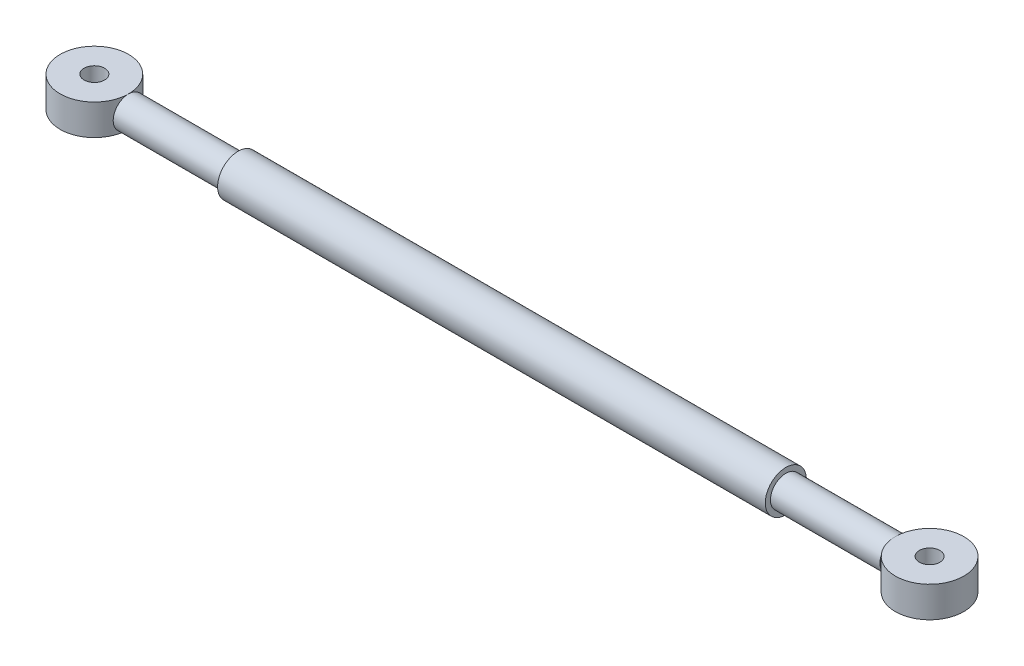
ISO-10303-21;
HEADER;
FILE_DESCRIPTION(('STEP AP214'),'2;1');
FILE_NAME('part.step','',(''),(''),'','','');
FILE_SCHEMA(('AUTOMOTIVE_DESIGN { 1 0 10303 214 1 1 1 1 }'));
ENDSEC;
DATA;
#1=APPLICATION_CONTEXT('core data for automotive mechanical design processes');
#2=APPLICATION_PROTOCOL_DEFINITION('international standard','automotive_design',2000,#1);
#3=PRODUCT_CONTEXT('',#1,'mechanical');
#4=PRODUCT('Part','Part','',(#3));
#5=PRODUCT_RELATED_PRODUCT_CATEGORY('part','',(#4));
#6=PRODUCT_DEFINITION_FORMATION('','',#4);
#7=PRODUCT_DEFINITION_CONTEXT('part definition',#1,'design');
#8=PRODUCT_DEFINITION('design','',#6,#7);
#9=PRODUCT_DEFINITION_SHAPE('','',#8);
#10=(LENGTH_UNIT() NAMED_UNIT(*) SI_UNIT(.MILLI.,.METRE.));
#11=(NAMED_UNIT(*) PLANE_ANGLE_UNIT() SI_UNIT($,.RADIAN.));
#12=(NAMED_UNIT(*) SI_UNIT($,.STERADIAN.) SOLID_ANGLE_UNIT());
#13=UNCERTAINTY_MEASURE_WITH_UNIT(LENGTH_MEASURE(1.E-05),#10,'distance_accuracy_value','');
#14=(GEOMETRIC_REPRESENTATION_CONTEXT(3) GLOBAL_UNCERTAINTY_ASSIGNED_CONTEXT((#13)) GLOBAL_UNIT_ASSIGNED_CONTEXT((#10,
#11,#12)) REPRESENTATION_CONTEXT('',''));
#15=CARTESIAN_POINT('',(0.,0.,0.));
#16=DIRECTION('',(0.,0.,1.));
#17=DIRECTION('',(1.,0.,0.));
#18=AXIS2_PLACEMENT_3D('',#15,#16,#17);
#19=CARTESIAN_POINT('',(-61.,2.25,0.));
#20=DIRECTION('',(0.,1.,0.));
#21=DIRECTION('',(0.,0.,1.));
#22=AXIS2_PLACEMENT_3D('',#19,#20,#21);
#23=PLANE('',#22);
#24=CARTESIAN_POINT('',(-61.,2.25,0.));
#25=DIRECTION('',(0.,1.,0.));
#26=DIRECTION('',(0.,0.,1.));
#27=AXIS2_PLACEMENT_3D('',#24,#25,#26);
#28=CIRCLE('',#27,5.);
#29=CARTESIAN_POINT('',(-61.,2.25,5.));
#30=VERTEX_POINT('',#29);
#31=EDGE_CURVE('E11',#30,#30,#28,.T.);
#32=ORIENTED_EDGE('',*,*,#31,.T.);
#33=EDGE_LOOP('',(#32));
#34=FACE_BOUND('',#33,.T.);
#35=CARTESIAN_POINT('',(-61.,2.25,0.));
#36=DIRECTION('',(0.,1.,0.));
#37=DIRECTION('',(0.,0.,1.));
#38=AXIS2_PLACEMENT_3D('',#35,#36,#37);
#39=CIRCLE('',#38,1.5);
#40=CARTESIAN_POINT('',(-61.,2.25,1.5));
#41=VERTEX_POINT('',#40);
#42=EDGE_CURVE('E52',#41,#41,#39,.T.);
#43=ORIENTED_EDGE('',*,*,#42,.F.);
#44=EDGE_LOOP('',(#43));
#45=FACE_BOUND('',#44,.T.);
#46=ADVANCED_FACE('F41',(#34,#45),#23,.T.);
#47=CARTESIAN_POINT('',(-61.,-2.25,0.));
#48=DIRECTION('',(0.,1.,0.));
#49=DIRECTION('',(0.,0.,1.));
#50=AXIS2_PLACEMENT_3D('',#47,#48,#49);
#51=PLANE('',#50);
#52=CARTESIAN_POINT('',(-61.,-2.25,0.));
#53=DIRECTION('',(0.,1.,0.));
#54=DIRECTION('',(0.,0.,1.));
#55=AXIS2_PLACEMENT_3D('',#52,#53,#54);
#56=CIRCLE('',#55,5.);
#57=CARTESIAN_POINT('',(-61.,-2.25,5.));
#58=VERTEX_POINT('',#57);
#59=EDGE_CURVE('E45',#58,#58,#56,.T.);
#60=ORIENTED_EDGE('',*,*,#59,.F.);
#61=EDGE_LOOP('',(#60));
#62=FACE_BOUND('',#61,.T.);
#63=CARTESIAN_POINT('',(-61.,-2.25,0.));
#64=DIRECTION('',(0.,1.,0.));
#65=DIRECTION('',(0.,0.,1.));
#66=AXIS2_PLACEMENT_3D('',#63,#64,#65);
#67=CIRCLE('',#66,1.5);
#68=CARTESIAN_POINT('',(-61.,-2.25,1.5));
#69=VERTEX_POINT('',#68);
#70=EDGE_CURVE('E54',#69,#69,#67,.T.);
#71=ORIENTED_EDGE('',*,*,#70,.T.);
#72=EDGE_LOOP('',(#71));
#73=FACE_BOUND('',#72,.T.);
#74=ADVANCED_FACE('F64',(#62,#73),#51,.F.);
#75=CARTESIAN_POINT('',(-61.,2.25,0.));
#76=DIRECTION('',(0.,-1.,0.));
#77=DIRECTION('',(0.,0.,-1.));
#78=AXIS2_PLACEMENT_3D('',#75,#76,#77);
#79=CYLINDRICAL_SURFACE('',#78,5.);
#80=ORIENTED_EDGE('',*,*,#31,.F.);
#81=EDGE_LOOP('',(#80));
#82=FACE_BOUND('',#81,.T.);
#83=ORIENTED_EDGE('',*,*,#59,.T.);
#84=EDGE_LOOP('',(#83));
#85=FACE_BOUND('',#84,.T.);
#86=ADVANCED_FACE('F43',(#82,#85),#79,.T.);
#87=CARTESIAN_POINT('',(-61.,2.25,0.));
#88=DIRECTION('',(0.,-1.,0.));
#89=DIRECTION('',(0.,0.,-1.));
#90=AXIS2_PLACEMENT_3D('',#87,#88,#89);
#91=CYLINDRICAL_SURFACE('',#90,1.5);
#92=ORIENTED_EDGE('',*,*,#42,.T.);
#93=EDGE_LOOP('',(#92));
#94=FACE_BOUND('',#93,.T.);
#95=ORIENTED_EDGE('',*,*,#70,.F.);
#96=EDGE_LOOP('',(#95));
#97=FACE_BOUND('',#96,.T.);
#98=ADVANCED_FACE('F60',(#94,#97),#91,.F.);
#99=CLOSED_SHELL('',(#46,#74,#86,#98));
#100=MANIFOLD_SOLID_BREP('B2',#99);
#101=CARTESIAN_POINT('',(61.,2.25,0.));
#102=DIRECTION('',(0.,1.,0.));
#103=DIRECTION('',(0.,0.,1.));
#104=AXIS2_PLACEMENT_3D('',#101,#102,#103);
#105=PLANE('',#104);
#106=CARTESIAN_POINT('',(61.,2.25,0.));
#107=DIRECTION('',(0.,1.,0.));
#108=DIRECTION('',(0.,0.,1.));
#109=AXIS2_PLACEMENT_3D('',#106,#107,#108);
#110=CIRCLE('',#109,5.);
#111=CARTESIAN_POINT('',(61.,2.25,5.));
#112=VERTEX_POINT('',#111);
#113=EDGE_CURVE('E40',#112,#112,#110,.T.);
#114=ORIENTED_EDGE('',*,*,#113,.T.);
#115=EDGE_LOOP('',(#114));
#116=FACE_BOUND('',#115,.T.);
#117=CARTESIAN_POINT('',(61.,2.25,0.));
#118=DIRECTION('',(0.,1.,0.));
#119=DIRECTION('',(0.,0.,1.));
#120=AXIS2_PLACEMENT_3D('',#117,#118,#119);
#121=CIRCLE('',#120,1.5);
#122=CARTESIAN_POINT('',(61.,2.25,1.5));
#123=VERTEX_POINT('',#122);
#124=EDGE_CURVE('E120',#123,#123,#121,.T.);
#125=ORIENTED_EDGE('',*,*,#124,.F.);
#126=EDGE_LOOP('',(#125));
#127=FACE_BOUND('',#126,.T.);
#128=ADVANCED_FACE('F109',(#116,#127),#105,.T.);
#129=CARTESIAN_POINT('',(61.,-2.25,0.));
#130=DIRECTION('',(0.,1.,0.));
#131=DIRECTION('',(0.,0.,1.));
#132=AXIS2_PLACEMENT_3D('',#129,#130,#131);
#133=PLANE('',#132);
#134=CARTESIAN_POINT('',(61.,-2.25,0.));
#135=DIRECTION('',(0.,1.,0.));
#136=DIRECTION('',(0.,0.,1.));
#137=AXIS2_PLACEMENT_3D('',#134,#135,#136);
#138=CIRCLE('',#137,5.);
#139=CARTESIAN_POINT('',(61.,-2.25,5.));
#140=VERTEX_POINT('',#139);
#141=EDGE_CURVE('E113',#140,#140,#138,.T.);
#142=ORIENTED_EDGE('',*,*,#141,.F.);
#143=EDGE_LOOP('',(#142));
#144=FACE_BOUND('',#143,.T.);
#145=CARTESIAN_POINT('',(61.,-2.25,0.));
#146=DIRECTION('',(0.,1.,0.));
#147=DIRECTION('',(0.,0.,1.));
#148=AXIS2_PLACEMENT_3D('',#145,#146,#147);
#149=CIRCLE('',#148,1.5);
#150=CARTESIAN_POINT('',(61.,-2.25,1.5));
#151=VERTEX_POINT('',#150);
#152=EDGE_CURVE('E122',#151,#151,#149,.T.);
#153=ORIENTED_EDGE('',*,*,#152,.T.);
#154=EDGE_LOOP('',(#153));
#155=FACE_BOUND('',#154,.T.);
#156=ADVANCED_FACE('F132',(#144,#155),#133,.F.);
#157=CARTESIAN_POINT('',(61.,2.25,0.));
#158=DIRECTION('',(0.,-1.,0.));
#159=DIRECTION('',(0.,0.,-1.));
#160=AXIS2_PLACEMENT_3D('',#157,#158,#159);
#161=CYLINDRICAL_SURFACE('',#160,5.);
#162=ORIENTED_EDGE('',*,*,#113,.F.);
#163=EDGE_LOOP('',(#162));
#164=FACE_BOUND('',#163,.T.);
#165=ORIENTED_EDGE('',*,*,#141,.T.);
#166=EDGE_LOOP('',(#165));
#167=FACE_BOUND('',#166,.T.);
#168=ADVANCED_FACE('F111',(#164,#167),#161,.T.);
#169=CARTESIAN_POINT('',(61.,2.25,0.));
#170=DIRECTION('',(0.,-1.,0.));
#171=DIRECTION('',(0.,0.,-1.));
#172=AXIS2_PLACEMENT_3D('',#169,#170,#171);
#173=CYLINDRICAL_SURFACE('',#172,1.5);
#174=ORIENTED_EDGE('',*,*,#124,.T.);
#175=EDGE_LOOP('',(#174));
#176=FACE_BOUND('',#175,.T.);
#177=ORIENTED_EDGE('',*,*,#152,.F.);
#178=EDGE_LOOP('',(#177));
#179=FACE_BOUND('',#178,.T.);
#180=ADVANCED_FACE('F128',(#176,#179),#173,.F.);
#181=CLOSED_SHELL('',(#128,#156,#168,#180));
#182=MANIFOLD_SOLID_BREP('B6',#181);
#183=CARTESIAN_POINT('',(40.,0.,0.));
#184=DIRECTION('',(-1.,0.,0.));
#185=DIRECTION('',(0.,0.,1.));
#186=AXIS2_PLACEMENT_3D('',#183,#184,#185);
#187=CYLINDRICAL_SURFACE('',#186,3.);
#188=CARTESIAN_POINT('',(40.,0.,0.));
#189=DIRECTION('',(1.,0.,0.));
#190=DIRECTION('',(0.,0.,-1.));
#191=AXIS2_PLACEMENT_3D('',#188,#189,#190);
#192=CIRCLE('',#191,3.);
#193=CARTESIAN_POINT('',(40.,0.,-3.));
#194=VERTEX_POINT('',#193);
#195=EDGE_CURVE('E182',#194,#194,#192,.T.);
#196=ORIENTED_EDGE('',*,*,#195,.F.);
#197=EDGE_LOOP('',(#196));
#198=FACE_BOUND('',#197,.T.);
#199=CARTESIAN_POINT('',(-40.,0.,0.));
#200=DIRECTION('',(1.,0.,0.));
#201=DIRECTION('',(0.,0.,-1.));
#202=AXIS2_PLACEMENT_3D('',#199,#200,#201);
#203=CIRCLE('',#202,3.);
#204=CARTESIAN_POINT('',(-40.,0.,-3.));
#205=VERTEX_POINT('',#204);
#206=EDGE_CURVE('E173',#205,#205,#203,.T.);
#207=ORIENTED_EDGE('',*,*,#206,.T.);
#208=EDGE_LOOP('',(#207));
#209=FACE_BOUND('',#208,.T.);
#210=ADVANCED_FACE('F170',(#198,#209),#187,.T.);
#211=CARTESIAN_POINT('',(40.,0.,0.));
#212=DIRECTION('',(1.,0.,0.));
#213=DIRECTION('',(0.,0.,-1.));
#214=AXIS2_PLACEMENT_3D('',#211,#212,#213);
#215=PLANE('',#214);
#216=CARTESIAN_POINT('',(40.,0.,0.));
#217=DIRECTION('',(1.,0.,0.));
#218=DIRECTION('',(0.,0.,-1.));
#219=AXIS2_PLACEMENT_3D('',#216,#217,#218);
#220=CIRCLE('',#219,2.25);
#221=CARTESIAN_POINT('',(40.,0.,-2.25));
#222=VERTEX_POINT('',#221);
#223=EDGE_CURVE('E177',#222,#222,#220,.T.);
#224=ORIENTED_EDGE('',*,*,#223,.F.);
#225=EDGE_LOOP('',(#224));
#226=FACE_BOUND('',#225,.T.);
#227=ORIENTED_EDGE('',*,*,#195,.T.);
#228=EDGE_LOOP('',(#227));
#229=FACE_BOUND('',#228,.T.);
#230=ADVANCED_FACE('F199',(#226,#229),#215,.T.);
#231=CARTESIAN_POINT('',(-40.,0.,0.));
#232=DIRECTION('',(1.,0.,0.));
#233=DIRECTION('',(0.,0.,-1.));
#234=AXIS2_PLACEMENT_3D('',#231,#232,#233);
#235=PLANE('',#234);
#236=CARTESIAN_POINT('',(-40.,0.,0.));
#237=DIRECTION('',(-1.,0.,0.));
#238=DIRECTION('',(0.,0.,1.));
#239=AXIS2_PLACEMENT_3D('',#236,#237,#238);
#240=CIRCLE('',#239,2.25);
#241=CARTESIAN_POINT('',(-40.,0.,2.25));
#242=VERTEX_POINT('',#241);
#243=EDGE_CURVE('E108',#242,#242,#240,.T.);
#244=ORIENTED_EDGE('',*,*,#243,.F.);
#245=EDGE_LOOP('',(#244));
#246=FACE_BOUND('',#245,.T.);
#247=ORIENTED_EDGE('',*,*,#206,.F.);
#248=EDGE_LOOP('',(#247));
#249=FACE_BOUND('',#248,.T.);
#250=ADVANCED_FACE('F196',(#246,#249),#235,.F.);
#251=CARTESIAN_POINT('',(56.,0.,0.));
#252=DIRECTION('',(-1.,0.,0.));
#253=DIRECTION('',(0.,0.,1.));
#254=AXIS2_PLACEMENT_3D('',#251,#252,#253);
#255=CYLINDRICAL_SURFACE('',#254,2.25);
#256=CARTESIAN_POINT('',(56.,0.,0.));
#257=DIRECTION('',(1.,0.,0.));
#258=DIRECTION('',(0.,0.,-1.));
#259=AXIS2_PLACEMENT_3D('',#256,#257,#258);
#260=CIRCLE('',#259,2.25);
#261=CARTESIAN_POINT('',(56.,0.,-2.25));
#262=VERTEX_POINT('',#261);
#263=EDGE_CURVE('E187',#262,#262,#260,.T.);
#264=ORIENTED_EDGE('',*,*,#263,.F.);
#265=EDGE_LOOP('',(#264));
#266=FACE_BOUND('',#265,.T.);
#267=ORIENTED_EDGE('',*,*,#223,.T.);
#268=EDGE_LOOP('',(#267));
#269=FACE_BOUND('',#268,.T.);
#270=ADVANCED_FACE('F198',(#266,#269),#255,.T.);
#271=CARTESIAN_POINT('',(56.,0.,0.));
#272=DIRECTION('',(1.,0.,0.));
#273=DIRECTION('',(0.,0.,-1.));
#274=AXIS2_PLACEMENT_3D('',#271,#272,#273);
#275=PLANE('',#274);
#276=ORIENTED_EDGE('',*,*,#263,.T.);
#277=EDGE_LOOP('',(#276));
#278=FACE_BOUND('',#277,.T.);
#279=ADVANCED_FACE('F205',(#278),#275,.T.);
#280=CARTESIAN_POINT('',(-56.,0.,0.));
#281=DIRECTION('',(1.,0.,0.));
#282=DIRECTION('',(0.,0.,-1.));
#283=AXIS2_PLACEMENT_3D('',#280,#281,#282);
#284=CYLINDRICAL_SURFACE('',#283,2.25);
#285=CARTESIAN_POINT('',(-56.,0.,0.));
#286=DIRECTION('',(-1.,0.,0.));
#287=DIRECTION('',(0.,0.,1.));
#288=AXIS2_PLACEMENT_3D('',#285,#286,#287);
#289=CIRCLE('',#288,2.25);
#290=CARTESIAN_POINT('',(-56.,0.,2.25));
#291=VERTEX_POINT('',#290);
#292=EDGE_CURVE('E186',#291,#291,#289,.T.);
#293=ORIENTED_EDGE('',*,*,#292,.F.);
#294=EDGE_LOOP('',(#293));
#295=FACE_BOUND('',#294,.T.);
#296=ORIENTED_EDGE('',*,*,#243,.T.);
#297=EDGE_LOOP('',(#296));
#298=FACE_BOUND('',#297,.T.);
#299=ADVANCED_FACE('F233',(#295,#298),#284,.T.);
#300=CARTESIAN_POINT('',(-56.,0.,0.));
#301=DIRECTION('',(-1.,0.,0.));
#302=DIRECTION('',(0.,0.,1.));
#303=AXIS2_PLACEMENT_3D('',#300,#301,#302);
#304=PLANE('',#303);
#305=ORIENTED_EDGE('',*,*,#292,.T.);
#306=EDGE_LOOP('',(#305));
#307=FACE_BOUND('',#306,.T.);
#308=ADVANCED_FACE('F247',(#307),#304,.T.);
#309=CLOSED_SHELL('',(#210,#230,#250,#270,#279,#299,#308));
#310=MANIFOLD_SOLID_BREP('B35',#309);
#311=ADVANCED_BREP_SHAPE_REPRESENTATION('',(#18,#100,#182,#310),#14);
#312=SHAPE_DEFINITION_REPRESENTATION(#9,#311);
ENDSEC;
END-ISO-10303-21;
